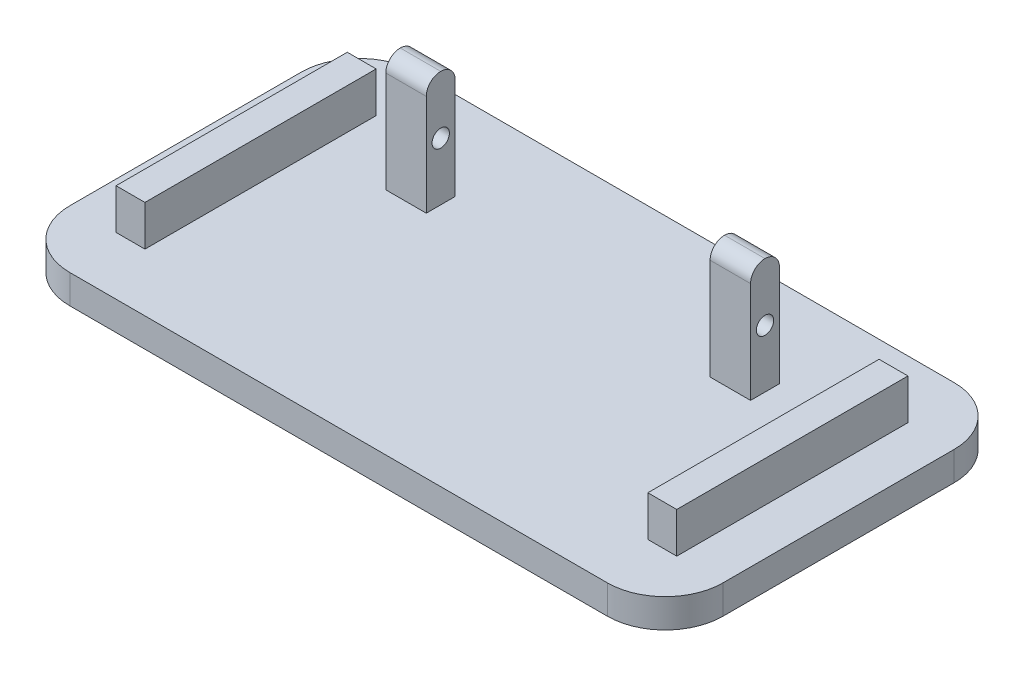
ISO-10303-21;
HEADER;
FILE_DESCRIPTION(('STEP AP214'),'2;1');
FILE_NAME('part.step','',(''),(''),'','','');
FILE_SCHEMA(('AUTOMOTIVE_DESIGN { 1 0 10303 214 1 1 1 1 }'));
ENDSEC;
DATA;
#1=APPLICATION_CONTEXT('core data for automotive mechanical design processes');
#2=APPLICATION_PROTOCOL_DEFINITION('international standard','automotive_design',2000,#1);
#3=PRODUCT_CONTEXT('',#1,'mechanical');
#4=PRODUCT('Part','Part','',(#3));
#5=PRODUCT_RELATED_PRODUCT_CATEGORY('part','',(#4));
#6=PRODUCT_DEFINITION_FORMATION('','',#4);
#7=PRODUCT_DEFINITION_CONTEXT('part definition',#1,'design');
#8=PRODUCT_DEFINITION('design','',#6,#7);
#9=PRODUCT_DEFINITION_SHAPE('','',#8);
#10=(LENGTH_UNIT() NAMED_UNIT(*) SI_UNIT(.MILLI.,.METRE.));
#11=(NAMED_UNIT(*) PLANE_ANGLE_UNIT() SI_UNIT($,.RADIAN.));
#12=(NAMED_UNIT(*) SI_UNIT($,.STERADIAN.) SOLID_ANGLE_UNIT());
#13=UNCERTAINTY_MEASURE_WITH_UNIT(LENGTH_MEASURE(1.E-05),#10,'distance_accuracy_value','');
#14=(GEOMETRIC_REPRESENTATION_CONTEXT(3) GLOBAL_UNCERTAINTY_ASSIGNED_CONTEXT((#13)) GLOBAL_UNIT_ASSIGNED_CONTEXT((#10,
#11,#12)) REPRESENTATION_CONTEXT('',''));
#15=CARTESIAN_POINT('',(0.,0.,0.));
#16=DIRECTION('',(0.,0.,1.));
#17=DIRECTION('',(1.,0.,0.));
#18=AXIS2_PLACEMENT_3D('',#15,#16,#17);
#19=CARTESIAN_POINT('',(79.785498489426,5.,-5.53323262839879));
#20=DIRECTION('',(0.,1.,0.));
#21=DIRECTION('',(0.,0.,1.));
#22=AXIS2_PLACEMENT_3D('',#19,#20,#21);
#23=PLANE('',#22);
#24=CARTESIAN_POINT('',(79.785498489426,5.,-5.53323262839879));
#25=DIRECTION('',(0.,1.,0.));
#26=DIRECTION('',(0.,0.,1.));
#27=AXIS2_PLACEMENT_3D('',#24,#25,#26);
#28=CIRCLE('',#27,10.);
#29=CARTESIAN_POINT('',(89.785498489426,5.,-5.53323262839872));
#30=VERTEX_POINT('',#29);
#31=CARTESIAN_POINT('',(79.7854984894259,5.,-15.5332326283988));
#32=VERTEX_POINT('',#31);
#33=EDGE_CURVE('E313',#30,#32,#28,.T.);
#34=ORIENTED_EDGE('',*,*,#33,.T.);
#35=DIRECTION('',(-1.,0.,0.));
#36=VECTOR('',#35,1.);
#37=CARTESIAN_POINT('',(-13.214501510574,5.,-15.5332326283988));
#38=LINE('',#37,#36);
#39=CARTESIAN_POINT('',(-13.214501510574,5.,-15.5332326283988));
#40=VERTEX_POINT('',#39);
#41=EDGE_CURVE('E316',#32,#40,#38,.T.);
#42=ORIENTED_EDGE('',*,*,#41,.T.);
#43=CARTESIAN_POINT('',(-13.214501510574,5.,-5.5332326283988));
#44=DIRECTION('',(0.,1.,0.));
#45=DIRECTION('',(0.,0.,-1.));
#46=AXIS2_PLACEMENT_3D('',#43,#44,#45);
#47=CIRCLE('',#46,10.);
#48=CARTESIAN_POINT('',(-23.214501510574,5.,-5.53323262839872));
#49=VERTEX_POINT('',#48);
#50=EDGE_CURVE('E319',#40,#49,#47,.T.);
#51=ORIENTED_EDGE('',*,*,#50,.T.);
#52=DIRECTION('',(0.,0.,1.));
#53=VECTOR('',#52,1.);
#54=CARTESIAN_POINT('',(-23.214501510574,5.,-5.53323262839872));
#55=LINE('',#54,#53);
#56=CARTESIAN_POINT('',(-23.214501510574,5.,34.4667673716011));
#57=VERTEX_POINT('',#56);
#58=EDGE_CURVE('E321',#49,#57,#55,.T.);
#59=ORIENTED_EDGE('',*,*,#58,.T.);
#60=CARTESIAN_POINT('',(-13.214501510574,5.,34.4667673716012));
#61=DIRECTION('',(0.,1.,0.));
#62=DIRECTION('',(0.,0.,-1.));
#63=AXIS2_PLACEMENT_3D('',#60,#61,#62);
#64=CIRCLE('',#63,10.);
#65=CARTESIAN_POINT('',(-13.214501510574,5.,44.4667673716012));
#66=VERTEX_POINT('',#65);
#67=EDGE_CURVE('E323',#57,#66,#64,.T.);
#68=ORIENTED_EDGE('',*,*,#67,.T.);
#69=DIRECTION('',(1.,0.,0.));
#70=VECTOR('',#69,1.);
#71=CARTESIAN_POINT('',(-13.214501510574,5.,44.4667673716012));
#72=LINE('',#71,#70);
#73=CARTESIAN_POINT('',(79.7854984894259,5.,44.4667673716012));
#74=VERTEX_POINT('',#73);
#75=EDGE_CURVE('E325',#66,#74,#72,.T.);
#76=ORIENTED_EDGE('',*,*,#75,.T.);
#77=CARTESIAN_POINT('',(79.785498489426,5.,34.4667673716012));
#78=DIRECTION('',(0.,1.,0.));
#79=DIRECTION('',(0.,0.,-1.));
#80=AXIS2_PLACEMENT_3D('',#77,#78,#79);
#81=CIRCLE('',#80,10.);
#82=CARTESIAN_POINT('',(89.785498489426,5.,34.4667673716011));
#83=VERTEX_POINT('',#82);
#84=EDGE_CURVE('E327',#74,#83,#81,.T.);
#85=ORIENTED_EDGE('',*,*,#84,.T.);
#86=DIRECTION('',(0.,0.,-1.));
#87=VECTOR('',#86,1.);
#88=CARTESIAN_POINT('',(89.785498489426,5.,-5.53323262839872));
#89=LINE('',#88,#87);
#90=EDGE_CURVE('E329',#83,#30,#89,.T.);
#91=ORIENTED_EDGE('',*,*,#90,.T.);
#92=EDGE_LOOP('',(#34,#42,#51,#59,#68,#76,#85,#91));
#93=FACE_BOUND('',#92,.T.);
#94=DIRECTION('',(1.,0.,0.));
#95=VECTOR('',#94,1.);
#96=CARTESIAN_POINT('',(1.73549848942599,5.,4.74755716237043));
#97=LINE('',#96,#95);
#98=CARTESIAN_POINT('',(1.73549848942599,5.,4.74755716237043));
#99=VERTEX_POINT('',#98);
#100=CARTESIAN_POINT('',(8.73549848942599,5.,4.74755716237042));
#101=VERTEX_POINT('',#100);
#102=EDGE_CURVE('E295',#99,#101,#97,.T.);
#103=ORIENTED_EDGE('',*,*,#102,.F.);
#104=DIRECTION('',(0.,0.,1.));
#105=VECTOR('',#104,1.);
#106=CARTESIAN_POINT('',(1.73549848942598,5.,-0.252442837629556));
#107=LINE('',#106,#105);
#108=CARTESIAN_POINT('',(1.73549848942598,5.,-0.252442837629556));
#109=VERTEX_POINT('',#108);
#110=EDGE_CURVE('E292',#109,#99,#107,.T.);
#111=ORIENTED_EDGE('',*,*,#110,.F.);
#112=DIRECTION('',(-1.,0.,0.));
#113=VECTOR('',#112,1.);
#114=CARTESIAN_POINT('',(1.73549848942598,5.,-0.252442837629556));
#115=LINE('',#114,#113);
#116=CARTESIAN_POINT('',(8.73549848942598,5.,-0.25244283762956));
#117=VERTEX_POINT('',#116);
#118=EDGE_CURVE('E301',#117,#109,#115,.T.);
#119=ORIENTED_EDGE('',*,*,#118,.F.);
#120=DIRECTION('',(0.,0.,-1.));
#121=VECTOR('',#120,1.);
#122=CARTESIAN_POINT('',(8.73549848942598,5.,-0.25244283762956));
#123=LINE('',#122,#121);
#124=EDGE_CURVE('E298',#101,#117,#123,.T.);
#125=ORIENTED_EDGE('',*,*,#124,.F.);
#126=EDGE_LOOP('',(#103,#111,#119,#125));
#127=FACE_BOUND('',#126,.T.);
#128=DIRECTION('',(0.,0.,1.));
#129=VECTOR('',#128,1.);
#130=CARTESIAN_POINT('',(57.835498489426,5.,-0.252442837629591));
#131=LINE('',#130,#129);
#132=CARTESIAN_POINT('',(57.835498489426,5.,-0.252442837629591));
#133=VERTEX_POINT('',#132);
#134=CARTESIAN_POINT('',(57.835498489426,5.,4.74755716237042));
#135=VERTEX_POINT('',#134);
#136=EDGE_CURVE('E275',#133,#135,#131,.T.);
#137=ORIENTED_EDGE('',*,*,#136,.F.);
#138=DIRECTION('',(-1.,0.,0.));
#139=VECTOR('',#138,1.);
#140=CARTESIAN_POINT('',(57.835498489426,5.,-0.252442837629591));
#141=LINE('',#140,#139);
#142=CARTESIAN_POINT('',(64.835498489426,5.,-0.252442837629594));
#143=VERTEX_POINT('',#142);
#144=EDGE_CURVE('E272',#143,#133,#141,.T.);
#145=ORIENTED_EDGE('',*,*,#144,.F.);
#146=DIRECTION('',(0.,0.,-1.));
#147=VECTOR('',#146,1.);
#148=CARTESIAN_POINT('',(64.835498489426,5.,-0.252442837629594));
#149=LINE('',#148,#147);
#150=CARTESIAN_POINT('',(64.835498489426,5.,4.74755716237042));
#151=VERTEX_POINT('',#150);
#152=EDGE_CURVE('E281',#151,#143,#149,.T.);
#153=ORIENTED_EDGE('',*,*,#152,.F.);
#154=DIRECTION('',(1.,0.,0.));
#155=VECTOR('',#154,1.);
#156=CARTESIAN_POINT('',(57.835498489426,5.,4.74755716237042));
#157=LINE('',#156,#155);
#158=EDGE_CURVE('E278',#135,#151,#157,.T.);
#159=ORIENTED_EDGE('',*,*,#158,.F.);
#160=EDGE_LOOP('',(#137,#145,#153,#159));
#161=FACE_BOUND('',#160,.T.);
#162=DIRECTION('',(1.,0.,0.));
#163=VECTOR('',#162,1.);
#164=CARTESIAN_POINT('',(-15.214501510574,5.,34.4667673716012));
#165=LINE('',#164,#163);
#166=CARTESIAN_POINT('',(-15.214501510574,5.,34.4667673716012));
#167=VERTEX_POINT('',#166);
#168=CARTESIAN_POINT('',(-10.214501510574,5.,34.4667673716012));
#169=VERTEX_POINT('',#168);
#170=EDGE_CURVE('E231',#167,#169,#165,.T.);
#171=ORIENTED_EDGE('',*,*,#170,.F.);
#172=DIRECTION('',(0.,0.,1.));
#173=VECTOR('',#172,1.);
#174=CARTESIAN_POINT('',(-15.214501510574,5.,-5.5332326283988));
#175=LINE('',#174,#173);
#176=CARTESIAN_POINT('',(-15.214501510574,5.,-5.5332326283988));
#177=VERTEX_POINT('',#176);
#178=EDGE_CURVE('E228',#177,#167,#175,.T.);
#179=ORIENTED_EDGE('',*,*,#178,.F.);
#180=DIRECTION('',(-1.,0.,0.));
#181=VECTOR('',#180,1.);
#182=CARTESIAN_POINT('',(-15.214501510574,5.,-5.5332326283988));
#183=LINE('',#182,#181);
#184=CARTESIAN_POINT('',(-10.214501510574,5.,-5.5332326283988));
#185=VERTEX_POINT('',#184);
#186=EDGE_CURVE('E241',#185,#177,#183,.T.);
#187=ORIENTED_EDGE('',*,*,#186,.F.);
#188=DIRECTION('',(0.,0.,-1.));
#189=VECTOR('',#188,1.);
#190=CARTESIAN_POINT('',(-10.214501510574,5.,-5.5332326283988));
#191=LINE('',#190,#189);
#192=EDGE_CURVE('E249',#169,#185,#191,.T.);
#193=ORIENTED_EDGE('',*,*,#192,.F.);
#194=EDGE_LOOP('',(#171,#179,#187,#193));
#195=FACE_BOUND('',#194,.T.);
#196=DIRECTION('',(1.,0.,0.));
#197=VECTOR('',#196,1.);
#198=CARTESIAN_POINT('',(76.785498489426,5.,34.4667673716012));
#199=LINE('',#198,#197);
#200=CARTESIAN_POINT('',(76.785498489426,5.,34.4667673716012));
#201=VERTEX_POINT('',#200);
#202=CARTESIAN_POINT('',(81.785498489426,5.,34.4667673716012));
#203=VERTEX_POINT('',#202);
#204=EDGE_CURVE('E417',#201,#203,#199,.T.);
#205=ORIENTED_EDGE('',*,*,#204,.F.);
#206=DIRECTION('',(0.,0.,1.));
#207=VECTOR('',#206,1.);
#208=CARTESIAN_POINT('',(76.7854984894259,5.,-5.5332326283988));
#209=LINE('',#208,#207);
#210=CARTESIAN_POINT('',(76.7854984894259,5.,-5.5332326283988));
#211=VERTEX_POINT('',#210);
#212=EDGE_CURVE('E226',#211,#201,#209,.T.);
#213=ORIENTED_EDGE('',*,*,#212,.F.);
#214=DIRECTION('',(-1.,0.,0.));
#215=VECTOR('',#214,1.);
#216=CARTESIAN_POINT('',(76.7854984894259,5.,-5.5332326283988));
#217=LINE('',#216,#215);
#218=CARTESIAN_POINT('',(81.785498489426,5.,-5.5332326283988));
#219=VERTEX_POINT('',#218);
#220=EDGE_CURVE('E222',#219,#211,#217,.T.);
#221=ORIENTED_EDGE('',*,*,#220,.F.);
#222=DIRECTION('',(0.,0.,-1.));
#223=VECTOR('',#222,1.);
#224=CARTESIAN_POINT('',(81.785498489426,5.,-5.5332326283988));
#225=LINE('',#224,#223);
#226=EDGE_CURVE('E419',#203,#219,#225,.T.);
#227=ORIENTED_EDGE('',*,*,#226,.F.);
#228=EDGE_LOOP('',(#205,#213,#221,#227));
#229=FACE_BOUND('',#228,.T.);
#230=ADVANCED_FACE('F33',(#93,#127,#161,#195,#229),#23,.T.);
#231=CARTESIAN_POINT('',(79.785498489426,5.,-5.53323262839879));
#232=DIRECTION('',(0.,-1.,0.));
#233=DIRECTION('',(0.,0.,-1.));
#234=AXIS2_PLACEMENT_3D('',#231,#232,#233);
#235=CYLINDRICAL_SURFACE('',#234,10.);
#236=CARTESIAN_POINT('',(79.785498489426,0.,-5.53323262839879));
#237=DIRECTION('',(0.,1.,0.));
#238=DIRECTION('',(0.,0.,1.));
#239=AXIS2_PLACEMENT_3D('',#236,#237,#238);
#240=CIRCLE('',#239,10.);
#241=CARTESIAN_POINT('',(89.785498489426,0.,-5.53323262839872));
#242=VERTEX_POINT('',#241);
#243=CARTESIAN_POINT('',(79.7854984894259,0.,-15.5332326283988));
#244=VERTEX_POINT('',#243);
#245=EDGE_CURVE('E312',#242,#244,#240,.T.);
#246=ORIENTED_EDGE('',*,*,#245,.T.);
#247=DIRECTION('',(0.,-1.,0.));
#248=VECTOR('',#247,1.);
#249=CARTESIAN_POINT('',(79.7854984894259,5.,-15.5332326283988));
#250=LINE('',#249,#248);
#251=EDGE_CURVE('E367',#32,#244,#250,.T.);
#252=ORIENTED_EDGE('',*,*,#251,.F.);
#253=ORIENTED_EDGE('',*,*,#33,.F.);
#254=DIRECTION('',(0.,-1.,0.));
#255=VECTOR('',#254,1.);
#256=CARTESIAN_POINT('',(89.785498489426,5.,-5.53323262839872));
#257=LINE('',#256,#255);
#258=EDGE_CURVE('E331',#30,#242,#257,.T.);
#259=ORIENTED_EDGE('',*,*,#258,.T.);
#260=EDGE_LOOP('',(#246,#252,#253,#259));
#261=FACE_BOUND('',#260,.T.);
#262=ADVANCED_FACE('F437',(#261),#235,.T.);
#263=CARTESIAN_POINT('',(-13.214501510574,5.,-15.5332326283988));
#264=DIRECTION('',(0.,0.,1.));
#265=DIRECTION('',(1.,0.,0.));
#266=AXIS2_PLACEMENT_3D('',#263,#264,#265);
#267=PLANE('',#266);
#268=DIRECTION('',(-1.,0.,0.));
#269=VECTOR('',#268,1.);
#270=CARTESIAN_POINT('',(-13.214501510574,0.,-15.5332326283988));
#271=LINE('',#270,#269);
#272=CARTESIAN_POINT('',(-13.214501510574,0.,-15.5332326283988));
#273=VERTEX_POINT('',#272);
#274=EDGE_CURVE('E334',#244,#273,#271,.T.);
#275=ORIENTED_EDGE('',*,*,#274,.T.);
#276=DIRECTION('',(0.,-1.,0.));
#277=VECTOR('',#276,1.);
#278=CARTESIAN_POINT('',(-13.214501510574,5.,-15.5332326283988));
#279=LINE('',#278,#277);
#280=EDGE_CURVE('E364',#40,#273,#279,.T.);
#281=ORIENTED_EDGE('',*,*,#280,.F.);
#282=ORIENTED_EDGE('',*,*,#41,.F.);
#283=ORIENTED_EDGE('',*,*,#251,.T.);
#284=EDGE_LOOP('',(#275,#281,#282,#283));
#285=FACE_BOUND('',#284,.T.);
#286=ADVANCED_FACE('F443',(#285),#267,.F.);
#287=CARTESIAN_POINT('',(-13.214501510574,5.,-5.5332326283988));
#288=DIRECTION('',(0.,-1.,0.));
#289=DIRECTION('',(0.,0.,-1.));
#290=AXIS2_PLACEMENT_3D('',#287,#288,#289);
#291=CYLINDRICAL_SURFACE('',#290,10.);
#292=CARTESIAN_POINT('',(-13.214501510574,0.,-5.5332326283988));
#293=DIRECTION('',(0.,1.,0.));
#294=DIRECTION('',(0.,0.,-1.));
#295=AXIS2_PLACEMENT_3D('',#292,#293,#294);
#296=CIRCLE('',#295,10.);
#297=CARTESIAN_POINT('',(-23.214501510574,0.,-5.53323262839872));
#298=VERTEX_POINT('',#297);
#299=EDGE_CURVE('E336',#273,#298,#296,.T.);
#300=ORIENTED_EDGE('',*,*,#299,.T.);
#301=DIRECTION('',(0.,-1.,0.));
#302=VECTOR('',#301,1.);
#303=CARTESIAN_POINT('',(-23.214501510574,5.,-5.53323262839872));
#304=LINE('',#303,#302);
#305=EDGE_CURVE('E361',#49,#298,#304,.T.);
#306=ORIENTED_EDGE('',*,*,#305,.F.);
#307=ORIENTED_EDGE('',*,*,#50,.F.);
#308=ORIENTED_EDGE('',*,*,#280,.T.);
#309=EDGE_LOOP('',(#300,#306,#307,#308));
#310=FACE_BOUND('',#309,.T.);
#311=ADVANCED_FACE('F474',(#310),#291,.T.);
#312=CARTESIAN_POINT('',(-23.214501510574,5.,-5.53323262839872));
#313=DIRECTION('',(1.,0.,0.));
#314=DIRECTION('',(0.,0.,-1.));
#315=AXIS2_PLACEMENT_3D('',#312,#313,#314);
#316=PLANE('',#315);
#317=DIRECTION('',(0.,0.,1.));
#318=VECTOR('',#317,1.);
#319=CARTESIAN_POINT('',(-23.214501510574,0.,-5.53323262839872));
#320=LINE('',#319,#318);
#321=CARTESIAN_POINT('',(-23.214501510574,0.,34.4667673716011));
#322=VERTEX_POINT('',#321);
#323=EDGE_CURVE('E338',#298,#322,#320,.T.);
#324=ORIENTED_EDGE('',*,*,#323,.T.);
#325=DIRECTION('',(0.,-1.,0.));
#326=VECTOR('',#325,1.);
#327=CARTESIAN_POINT('',(-23.214501510574,5.,34.4667673716011));
#328=LINE('',#327,#326);
#329=EDGE_CURVE('E358',#57,#322,#328,.T.);
#330=ORIENTED_EDGE('',*,*,#329,.F.);
#331=ORIENTED_EDGE('',*,*,#58,.F.);
#332=ORIENTED_EDGE('',*,*,#305,.T.);
#333=EDGE_LOOP('',(#324,#330,#331,#332));
#334=FACE_BOUND('',#333,.T.);
#335=ADVANCED_FACE('F470',(#334),#316,.F.);
#336=CARTESIAN_POINT('',(-13.214501510574,5.,34.4667673716012));
#337=DIRECTION('',(0.,-1.,0.));
#338=DIRECTION('',(0.,0.,-1.));
#339=AXIS2_PLACEMENT_3D('',#336,#337,#338);
#340=CYLINDRICAL_SURFACE('',#339,10.);
#341=CARTESIAN_POINT('',(-13.214501510574,0.,34.4667673716012));
#342=DIRECTION('',(0.,1.,0.));
#343=DIRECTION('',(0.,0.,-1.));
#344=AXIS2_PLACEMENT_3D('',#341,#342,#343);
#345=CIRCLE('',#344,10.);
#346=CARTESIAN_POINT('',(-13.214501510574,0.,44.4667673716012));
#347=VERTEX_POINT('',#346);
#348=EDGE_CURVE('E340',#322,#347,#345,.T.);
#349=ORIENTED_EDGE('',*,*,#348,.T.);
#350=DIRECTION('',(0.,-1.,0.));
#351=VECTOR('',#350,1.);
#352=CARTESIAN_POINT('',(-13.214501510574,5.,44.4667673716012));
#353=LINE('',#352,#351);
#354=EDGE_CURVE('E355',#66,#347,#353,.T.);
#355=ORIENTED_EDGE('',*,*,#354,.F.);
#356=ORIENTED_EDGE('',*,*,#67,.F.);
#357=ORIENTED_EDGE('',*,*,#329,.T.);
#358=EDGE_LOOP('',(#349,#355,#356,#357));
#359=FACE_BOUND('',#358,.T.);
#360=ADVANCED_FACE('F466',(#359),#340,.T.);
#361=CARTESIAN_POINT('',(-13.214501510574,5.,44.4667673716012));
#362=DIRECTION('',(0.,0.,-1.));
#363=DIRECTION('',(-1.,0.,0.));
#364=AXIS2_PLACEMENT_3D('',#361,#362,#363);
#365=PLANE('',#364);
#366=DIRECTION('',(1.,0.,0.));
#367=VECTOR('',#366,1.);
#368=CARTESIAN_POINT('',(-13.214501510574,0.,44.4667673716012));
#369=LINE('',#368,#367);
#370=CARTESIAN_POINT('',(79.7854984894259,0.,44.4667673716012));
#371=VERTEX_POINT('',#370);
#372=EDGE_CURVE('E342',#347,#371,#369,.T.);
#373=ORIENTED_EDGE('',*,*,#372,.T.);
#374=DIRECTION('',(0.,-1.,0.));
#375=VECTOR('',#374,1.);
#376=CARTESIAN_POINT('',(79.7854984894259,5.,44.4667673716012));
#377=LINE('',#376,#375);
#378=EDGE_CURVE('E352',#74,#371,#377,.T.);
#379=ORIENTED_EDGE('',*,*,#378,.F.);
#380=ORIENTED_EDGE('',*,*,#75,.F.);
#381=ORIENTED_EDGE('',*,*,#354,.T.);
#382=EDGE_LOOP('',(#373,#379,#380,#381));
#383=FACE_BOUND('',#382,.T.);
#384=ADVANCED_FACE('F462',(#383),#365,.F.);
#385=CARTESIAN_POINT('',(79.785498489426,5.,34.4667673716012));
#386=DIRECTION('',(0.,-1.,0.));
#387=DIRECTION('',(0.,0.,-1.));
#388=AXIS2_PLACEMENT_3D('',#385,#386,#387);
#389=CYLINDRICAL_SURFACE('',#388,10.);
#390=CARTESIAN_POINT('',(79.785498489426,0.,34.4667673716012));
#391=DIRECTION('',(0.,1.,0.));
#392=DIRECTION('',(0.,0.,-1.));
#393=AXIS2_PLACEMENT_3D('',#390,#391,#392);
#394=CIRCLE('',#393,10.);
#395=CARTESIAN_POINT('',(89.785498489426,0.,34.4667673716011));
#396=VERTEX_POINT('',#395);
#397=EDGE_CURVE('E344',#371,#396,#394,.T.);
#398=ORIENTED_EDGE('',*,*,#397,.T.);
#399=DIRECTION('',(0.,-1.,0.));
#400=VECTOR('',#399,1.);
#401=CARTESIAN_POINT('',(89.785498489426,5.,34.4667673716011));
#402=LINE('',#401,#400);
#403=EDGE_CURVE('E349',#83,#396,#402,.T.);
#404=ORIENTED_EDGE('',*,*,#403,.F.);
#405=ORIENTED_EDGE('',*,*,#84,.F.);
#406=ORIENTED_EDGE('',*,*,#378,.T.);
#407=EDGE_LOOP('',(#398,#404,#405,#406));
#408=FACE_BOUND('',#407,.T.);
#409=ADVANCED_FACE('F458',(#408),#389,.T.);
#410=CARTESIAN_POINT('',(89.785498489426,5.,-5.53323262839872));
#411=DIRECTION('',(-1.,0.,0.));
#412=DIRECTION('',(0.,0.,1.));
#413=AXIS2_PLACEMENT_3D('',#410,#411,#412);
#414=PLANE('',#413);
#415=DIRECTION('',(0.,0.,-1.));
#416=VECTOR('',#415,1.);
#417=CARTESIAN_POINT('',(89.785498489426,0.,-5.53323262839872));
#418=LINE('',#417,#416);
#419=EDGE_CURVE('E317',#396,#242,#418,.T.);
#420=ORIENTED_EDGE('',*,*,#419,.T.);
#421=ORIENTED_EDGE('',*,*,#258,.F.);
#422=ORIENTED_EDGE('',*,*,#90,.F.);
#423=ORIENTED_EDGE('',*,*,#403,.T.);
#424=EDGE_LOOP('',(#420,#421,#422,#423));
#425=FACE_BOUND('',#424,.T.);
#426=ADVANCED_FACE('F454',(#425),#414,.F.);
#427=CARTESIAN_POINT('',(79.785498489426,0.,-5.53323262839879));
#428=DIRECTION('',(0.,1.,0.));
#429=DIRECTION('',(0.,0.,1.));
#430=AXIS2_PLACEMENT_3D('',#427,#428,#429);
#431=PLANE('',#430);
#432=ORIENTED_EDGE('',*,*,#245,.F.);
#433=ORIENTED_EDGE('',*,*,#419,.F.);
#434=ORIENTED_EDGE('',*,*,#397,.F.);
#435=ORIENTED_EDGE('',*,*,#372,.F.);
#436=ORIENTED_EDGE('',*,*,#348,.F.);
#437=ORIENTED_EDGE('',*,*,#323,.F.);
#438=ORIENTED_EDGE('',*,*,#299,.F.);
#439=ORIENTED_EDGE('',*,*,#274,.F.);
#440=EDGE_LOOP('',(#432,#433,#434,#435,#436,#437,#438,#439));
#441=FACE_BOUND('',#440,.T.);
#442=ADVANCED_FACE('F451',(#441),#431,.F.);
#443=CARTESIAN_POINT('',(1.73549848942598,25.,-0.252442837629556));
#444=DIRECTION('',(1.,0.,0.));
#445=DIRECTION('',(0.,0.,-1.));
#446=AXIS2_PLACEMENT_3D('',#443,#444,#445);
#447=PLANE('',#446);
#448=CARTESIAN_POINT('',(1.73549848942599,15.,2.24755716237043));
#449=DIRECTION('',(-1.,0.,0.));
#450=DIRECTION('',(0.,0.,1.));
#451=AXIS2_PLACEMENT_3D('',#448,#449,#450);
#452=CIRCLE('',#451,1.5);
#453=CARTESIAN_POINT('',(1.73549848942599,15.,3.74755716237043));
#454=VERTEX_POINT('',#453);
#455=EDGE_CURVE('E262',#454,#454,#452,.T.);
#456=ORIENTED_EDGE('',*,*,#455,.F.);
#457=EDGE_LOOP('',(#456));
#458=FACE_BOUND('',#457,.T.);
#459=DIRECTION('',(0.,-1.,0.));
#460=VECTOR('',#459,1.);
#461=CARTESIAN_POINT('',(1.73549848942599,25.,4.74755716237043));
#462=LINE('',#461,#460);
#463=CARTESIAN_POINT('',(1.73549848942599,22.5,4.74755716237043));
#464=VERTEX_POINT('',#463);
#465=EDGE_CURVE('E310',#464,#99,#462,.T.);
#466=ORIENTED_EDGE('',*,*,#465,.F.);
#467=CARTESIAN_POINT('',(1.73549848942599,22.5,2.24755716237043));
#468=DIRECTION('',(1.,0.,0.));
#469=DIRECTION('',(0.,0.,-1.));
#470=AXIS2_PLACEMENT_3D('',#467,#468,#469);
#471=CIRCLE('',#470,2.5);
#472=CARTESIAN_POINT('',(1.73549848942599,25.,2.24755716237044));
#473=VERTEX_POINT('',#472);
#474=EDGE_CURVE('E386',#464,#473,#471,.F.);
#475=ORIENTED_EDGE('',*,*,#474,.T.);
#476=CARTESIAN_POINT('',(1.73549848942599,22.5,2.24755716237044));
#477=DIRECTION('',(1.,0.,0.));
#478=DIRECTION('',(0.,0.,-1.));
#479=AXIS2_PLACEMENT_3D('',#476,#477,#478);
#480=CIRCLE('',#479,2.5);
#481=CARTESIAN_POINT('',(1.73549848942598,22.5,-0.252442837629556));
#482=VERTEX_POINT('',#481);
#483=EDGE_CURVE('E375',#473,#482,#480,.F.);
#484=ORIENTED_EDGE('',*,*,#483,.T.);
#485=DIRECTION('',(0.,-1.,0.));
#486=VECTOR('',#485,1.);
#487=CARTESIAN_POINT('',(1.73549848942598,25.,-0.252442837629556));
#488=LINE('',#487,#486);
#489=EDGE_CURVE('E304',#482,#109,#488,.T.);
#490=ORIENTED_EDGE('',*,*,#489,.T.);
#491=ORIENTED_EDGE('',*,*,#110,.T.);
#492=EDGE_LOOP('',(#466,#475,#484,#490,#491));
#493=FACE_BOUND('',#492,.T.);
#494=ADVANCED_FACE('F449',(#458,#493),#447,.F.);
#495=CARTESIAN_POINT('',(1.73549848942599,25.,4.74755716237043));
#496=DIRECTION('',(0.,0.,-1.));
#497=DIRECTION('',(-1.,0.,0.));
#498=AXIS2_PLACEMENT_3D('',#495,#496,#497);
#499=PLANE('',#498);
#500=DIRECTION('',(0.,-1.,0.));
#501=VECTOR('',#500,1.);
#502=CARTESIAN_POINT('',(8.73549848942599,25.,4.74755716237042));
#503=LINE('',#502,#501);
#504=CARTESIAN_POINT('',(8.73549848942599,22.5,4.74755716237042));
#505=VERTEX_POINT('',#504);
#506=EDGE_CURVE('E308',#505,#101,#503,.T.);
#507=ORIENTED_EDGE('',*,*,#506,.F.);
#508=DIRECTION('',(1.,0.,0.));
#509=VECTOR('',#508,1.);
#510=CARTESIAN_POINT('',(1.73549848942599,22.5,4.74755716237043));
#511=LINE('',#510,#509);
#512=EDGE_CURVE('E384',#505,#464,#511,.F.);
#513=ORIENTED_EDGE('',*,*,#512,.T.);
#514=ORIENTED_EDGE('',*,*,#465,.T.);
#515=ORIENTED_EDGE('',*,*,#102,.T.);
#516=EDGE_LOOP('',(#507,#513,#514,#515));
#517=FACE_BOUND('',#516,.T.);
#518=ADVANCED_FACE('F513',(#517),#499,.F.);
#519=CARTESIAN_POINT('',(8.73549848942598,25.,-0.25244283762956));
#520=DIRECTION('',(-1.,0.,0.));
#521=DIRECTION('',(0.,0.,1.));
#522=AXIS2_PLACEMENT_3D('',#519,#520,#521);
#523=PLANE('',#522);
#524=CARTESIAN_POINT('',(8.73549848942598,15.,2.24755716237042));
#525=DIRECTION('',(-1.,0.,0.));
#526=DIRECTION('',(0.,0.,1.));
#527=AXIS2_PLACEMENT_3D('',#524,#525,#526);
#528=CIRCLE('',#527,1.5);
#529=CARTESIAN_POINT('',(8.73549848942598,15.,3.74755716237042));
#530=VERTEX_POINT('',#529);
#531=EDGE_CURVE('E269',#530,#530,#528,.T.);
#532=ORIENTED_EDGE('',*,*,#531,.T.);
#533=EDGE_LOOP('',(#532));
#534=FACE_BOUND('',#533,.T.);
#535=CARTESIAN_POINT('',(8.73549848942599,22.5,2.24755716237044));
#536=DIRECTION('',(-1.,0.,0.));
#537=DIRECTION('',(0.,0.,1.));
#538=AXIS2_PLACEMENT_3D('',#535,#536,#537);
#539=CIRCLE('',#538,2.5);
#540=CARTESIAN_POINT('',(8.73549848942598,22.5,-0.25244283762956));
#541=VERTEX_POINT('',#540);
#542=CARTESIAN_POINT('',(8.73549848942599,25.,2.24755716237044));
#543=VERTEX_POINT('',#542);
#544=EDGE_CURVE('E379',#541,#543,#539,.F.);
#545=ORIENTED_EDGE('',*,*,#544,.T.);
#546=CARTESIAN_POINT('',(8.73549848942599,22.5,2.24755716237042));
#547=DIRECTION('',(-1.,0.,0.));
#548=DIRECTION('',(0.,0.,1.));
#549=AXIS2_PLACEMENT_3D('',#546,#547,#548);
#550=CIRCLE('',#549,2.5);
#551=EDGE_CURVE('E382',#543,#505,#550,.F.);
#552=ORIENTED_EDGE('',*,*,#551,.T.);
#553=ORIENTED_EDGE('',*,*,#506,.T.);
#554=ORIENTED_EDGE('',*,*,#124,.T.);
#555=DIRECTION('',(0.,-1.,0.));
#556=VECTOR('',#555,1.);
#557=CARTESIAN_POINT('',(8.73549848942598,25.,-0.25244283762956));
#558=LINE('',#557,#556);
#559=EDGE_CURVE('E306',#541,#117,#558,.T.);
#560=ORIENTED_EDGE('',*,*,#559,.F.);
#561=EDGE_LOOP('',(#545,#552,#553,#554,#560));
#562=FACE_BOUND('',#561,.T.);
#563=ADVANCED_FACE('F507',(#534,#562),#523,.F.);
#564=CARTESIAN_POINT('',(1.73549848942598,25.,-0.252442837629556));
#565=DIRECTION('',(0.,0.,1.));
#566=DIRECTION('',(1.,0.,0.));
#567=AXIS2_PLACEMENT_3D('',#564,#565,#566);
#568=PLANE('',#567);
#569=ORIENTED_EDGE('',*,*,#489,.F.);
#570=DIRECTION('',(-1.,0.,0.));
#571=VECTOR('',#570,1.);
#572=CARTESIAN_POINT('',(8.73549848942598,22.5,-0.25244283762956));
#573=LINE('',#572,#571);
#574=EDGE_CURVE('E377',#482,#541,#573,.F.);
#575=ORIENTED_EDGE('',*,*,#574,.T.);
#576=ORIENTED_EDGE('',*,*,#559,.T.);
#577=ORIENTED_EDGE('',*,*,#118,.T.);
#578=EDGE_LOOP('',(#569,#575,#576,#577));
#579=FACE_BOUND('',#578,.T.);
#580=ADVANCED_FACE('F499',(#579),#568,.F.);
#581=CARTESIAN_POINT('',(57.835498489426,25.,-0.252442837629591));
#582=DIRECTION('',(0.,0.,1.));
#583=DIRECTION('',(1.,0.,0.));
#584=AXIS2_PLACEMENT_3D('',#581,#582,#583);
#585=PLANE('',#584);
#586=DIRECTION('',(0.,-1.,0.));
#587=VECTOR('',#586,1.);
#588=CARTESIAN_POINT('',(57.835498489426,25.,-0.252442837629591));
#589=LINE('',#588,#587);
#590=CARTESIAN_POINT('',(57.835498489426,22.5,-0.252442837629591));
#591=VERTEX_POINT('',#590);
#592=EDGE_CURVE('E290',#591,#133,#589,.T.);
#593=ORIENTED_EDGE('',*,*,#592,.F.);
#594=DIRECTION('',(-1.,0.,0.));
#595=VECTOR('',#594,1.);
#596=CARTESIAN_POINT('',(57.835498489426,22.5,-0.252442837629591));
#597=LINE('',#596,#595);
#598=CARTESIAN_POINT('',(64.835498489426,22.5,-0.252442837629594));
#599=VERTEX_POINT('',#598);
#600=EDGE_CURVE('E11',#591,#599,#597,.F.);
#601=ORIENTED_EDGE('',*,*,#600,.T.);
#602=DIRECTION('',(0.,-1.,0.));
#603=VECTOR('',#602,1.);
#604=CARTESIAN_POINT('',(64.835498489426,25.,-0.252442837629594));
#605=LINE('',#604,#603);
#606=EDGE_CURVE('E284',#599,#143,#605,.T.);
#607=ORIENTED_EDGE('',*,*,#606,.T.);
#608=ORIENTED_EDGE('',*,*,#144,.T.);
#609=EDGE_LOOP('',(#593,#601,#607,#608));
#610=FACE_BOUND('',#609,.T.);
#611=ADVANCED_FACE('F497',(#610),#585,.F.);
#612=CARTESIAN_POINT('',(57.835498489426,25.,-0.252442837629591));
#613=DIRECTION('',(1.,0.,0.));
#614=DIRECTION('',(0.,0.,-1.));
#615=AXIS2_PLACEMENT_3D('',#612,#613,#614);
#616=PLANE('',#615);
#617=CARTESIAN_POINT('',(57.835498489426,15.,2.24755716237042));
#618=DIRECTION('',(1.,0.,0.));
#619=DIRECTION('',(0.,0.,-1.));
#620=AXIS2_PLACEMENT_3D('',#617,#618,#619);
#621=CIRCLE('',#620,1.5);
#622=CARTESIAN_POINT('',(57.835498489426,15.,0.747557162370421));
#623=VERTEX_POINT('',#622);
#624=EDGE_CURVE('E266',#623,#623,#621,.T.);
#625=ORIENTED_EDGE('',*,*,#624,.T.);
#626=EDGE_LOOP('',(#625));
#627=FACE_BOUND('',#626,.T.);
#628=DIRECTION('',(0.,-1.,0.));
#629=VECTOR('',#628,1.);
#630=CARTESIAN_POINT('',(57.835498489426,25.,4.74755716237042));
#631=LINE('',#630,#629);
#632=CARTESIAN_POINT('',(57.835498489426,22.5,4.74755716237042));
#633=VERTEX_POINT('',#632);
#634=EDGE_CURVE('E288',#633,#135,#631,.T.);
#635=ORIENTED_EDGE('',*,*,#634,.F.);
#636=CARTESIAN_POINT('',(57.835498489426,22.5,2.24755716237042));
#637=DIRECTION('',(1.,0.,0.));
#638=DIRECTION('',(0.,0.,-1.));
#639=AXIS2_PLACEMENT_3D('',#636,#637,#638);
#640=CIRCLE('',#639,2.5);
#641=CARTESIAN_POINT('',(57.835498489426,25.,2.24755716237041));
#642=VERTEX_POINT('',#641);
#643=EDGE_CURVE('E42',#633,#642,#640,.F.);
#644=ORIENTED_EDGE('',*,*,#643,.T.);
#645=CARTESIAN_POINT('',(57.835498489426,22.5,2.24755716237041));
#646=DIRECTION('',(1.,0.,0.));
#647=DIRECTION('',(0.,0.,-1.));
#648=AXIS2_PLACEMENT_3D('',#645,#646,#647);
#649=CIRCLE('',#648,2.5);
#650=EDGE_CURVE('E49',#642,#591,#649,.F.);
#651=ORIENTED_EDGE('',*,*,#650,.T.);
#652=ORIENTED_EDGE('',*,*,#592,.T.);
#653=ORIENTED_EDGE('',*,*,#136,.T.);
#654=EDGE_LOOP('',(#635,#644,#651,#652,#653));
#655=FACE_BOUND('',#654,.T.);
#656=ADVANCED_FACE('F402',(#627,#655),#616,.F.);
#657=CARTESIAN_POINT('',(57.835498489426,25.,4.74755716237042));
#658=DIRECTION('',(0.,0.,-1.));
#659=DIRECTION('',(-1.,0.,0.));
#660=AXIS2_PLACEMENT_3D('',#657,#658,#659);
#661=PLANE('',#660);
#662=DIRECTION('',(0.,-1.,0.));
#663=VECTOR('',#662,1.);
#664=CARTESIAN_POINT('',(64.835498489426,25.,4.74755716237042));
#665=LINE('',#664,#663);
#666=CARTESIAN_POINT('',(64.835498489426,22.5,4.74755716237042));
#667=VERTEX_POINT('',#666);
#668=EDGE_CURVE('E286',#667,#151,#665,.T.);
#669=ORIENTED_EDGE('',*,*,#668,.F.);
#670=DIRECTION('',(1.,0.,0.));
#671=VECTOR('',#670,1.);
#672=CARTESIAN_POINT('',(57.835498489426,22.5,4.74755716237042));
#673=LINE('',#672,#671);
#674=EDGE_CURVE('E392',#667,#633,#673,.F.);
#675=ORIENTED_EDGE('',*,*,#674,.T.);
#676=ORIENTED_EDGE('',*,*,#634,.T.);
#677=ORIENTED_EDGE('',*,*,#158,.T.);
#678=EDGE_LOOP('',(#669,#675,#676,#677));
#679=FACE_BOUND('',#678,.T.);
#680=ADVANCED_FACE('F399',(#679),#661,.F.);
#681=CARTESIAN_POINT('',(64.835498489426,25.,-0.252442837629594));
#682=DIRECTION('',(-1.,0.,0.));
#683=DIRECTION('',(0.,0.,1.));
#684=AXIS2_PLACEMENT_3D('',#681,#682,#683);
#685=PLANE('',#684);
#686=CARTESIAN_POINT('',(64.835498489426,15.,2.24755716237042));
#687=DIRECTION('',(-1.,0.,0.));
#688=DIRECTION('',(0.,0.,1.));
#689=AXIS2_PLACEMENT_3D('',#686,#687,#688);
#690=CIRCLE('',#689,1.5);
#691=CARTESIAN_POINT('',(64.835498489426,15.,3.74755716237042));
#692=VERTEX_POINT('',#691);
#693=EDGE_CURVE('E265',#692,#692,#690,.T.);
#694=ORIENTED_EDGE('',*,*,#693,.T.);
#695=EDGE_LOOP('',(#694));
#696=FACE_BOUND('',#695,.T.);
#697=CARTESIAN_POINT('',(64.835498489426,22.5,2.24755716237041));
#698=DIRECTION('',(-1.,0.,0.));
#699=DIRECTION('',(0.,0.,1.));
#700=AXIS2_PLACEMENT_3D('',#697,#698,#699);
#701=CIRCLE('',#700,2.5);
#702=CARTESIAN_POINT('',(64.835498489426,25.,2.24755716237041));
#703=VERTEX_POINT('',#702);
#704=EDGE_CURVE('E388',#599,#703,#701,.F.);
#705=ORIENTED_EDGE('',*,*,#704,.T.);
#706=CARTESIAN_POINT('',(64.835498489426,22.5,2.24755716237042));
#707=DIRECTION('',(-1.,0.,0.));
#708=DIRECTION('',(0.,0.,1.));
#709=AXIS2_PLACEMENT_3D('',#706,#707,#708);
#710=CIRCLE('',#709,2.5);
#711=EDGE_CURVE('E390',#703,#667,#710,.F.);
#712=ORIENTED_EDGE('',*,*,#711,.T.);
#713=ORIENTED_EDGE('',*,*,#668,.T.);
#714=ORIENTED_EDGE('',*,*,#152,.T.);
#715=ORIENTED_EDGE('',*,*,#606,.F.);
#716=EDGE_LOOP('',(#705,#712,#713,#714,#715));
#717=FACE_BOUND('',#716,.T.);
#718=ADVANCED_FACE('F411',(#696,#717),#685,.F.);
#719=CARTESIAN_POINT('',(89.785498489426,15.,2.24755716237042));
#720=DIRECTION('',(-1.,0.,0.));
#721=DIRECTION('',(0.,0.,1.));
#722=AXIS2_PLACEMENT_3D('',#719,#720,#721);
#723=CYLINDRICAL_SURFACE('',#722,1.5);
#724=ORIENTED_EDGE('',*,*,#693,.F.);
#725=EDGE_LOOP('',(#724));
#726=FACE_BOUND('',#725,.T.);
#727=ORIENTED_EDGE('',*,*,#624,.F.);
#728=EDGE_LOOP('',(#727));
#729=FACE_BOUND('',#728,.T.);
#730=ADVANCED_FACE('F545',(#726,#729),#723,.F.);
#731=ORIENTED_EDGE('',*,*,#455,.T.);
#732=EDGE_LOOP('',(#731));
#733=FACE_BOUND('',#732,.T.);
#734=ORIENTED_EDGE('',*,*,#531,.F.);
#735=EDGE_LOOP('',(#734));
#736=FACE_BOUND('',#735,.T.);
#737=ADVANCED_FACE('F541',(#733,#736),#723,.F.);
#738=CARTESIAN_POINT('',(-15.214501510574,12.,-5.5332326283988));
#739=DIRECTION('',(1.,0.,0.));
#740=DIRECTION('',(0.,0.,-1.));
#741=AXIS2_PLACEMENT_3D('',#738,#739,#740);
#742=PLANE('',#741);
#743=ORIENTED_EDGE('',*,*,#178,.T.);
#744=DIRECTION('',(0.,-1.,0.));
#745=VECTOR('',#744,1.);
#746=CARTESIAN_POINT('',(-15.214501510574,12.,34.4667673716012));
#747=LINE('',#746,#745);
#748=CARTESIAN_POINT('',(-15.214501510574,12.,34.4667673716012));
#749=VERTEX_POINT('',#748);
#750=EDGE_CURVE('E260',#749,#167,#747,.T.);
#751=ORIENTED_EDGE('',*,*,#750,.F.);
#752=DIRECTION('',(0.,0.,1.));
#753=VECTOR('',#752,1.);
#754=CARTESIAN_POINT('',(-15.214501510574,12.,-5.5332326283988));
#755=LINE('',#754,#753);
#756=CARTESIAN_POINT('',(-15.214501510574,12.,-5.5332326283988));
#757=VERTEX_POINT('',#756);
#758=EDGE_CURVE('E237',#757,#749,#755,.T.);
#759=ORIENTED_EDGE('',*,*,#758,.F.);
#760=DIRECTION('',(0.,-1.,0.));
#761=VECTOR('',#760,1.);
#762=CARTESIAN_POINT('',(-15.214501510574,12.,-5.5332326283988));
#763=LINE('',#762,#761);
#764=EDGE_CURVE('E246',#757,#177,#763,.T.);
#765=ORIENTED_EDGE('',*,*,#764,.T.);
#766=EDGE_LOOP('',(#743,#751,#759,#765));
#767=FACE_BOUND('',#766,.T.);
#768=ADVANCED_FACE('F544',(#767),#742,.F.);
#769=CARTESIAN_POINT('',(-15.214501510574,12.,34.4667673716012));
#770=DIRECTION('',(0.,0.,-1.));
#771=DIRECTION('',(-1.,0.,0.));
#772=AXIS2_PLACEMENT_3D('',#769,#770,#771);
#773=PLANE('',#772);
#774=ORIENTED_EDGE('',*,*,#170,.T.);
#775=DIRECTION('',(0.,-1.,0.));
#776=VECTOR('',#775,1.);
#777=CARTESIAN_POINT('',(-10.214501510574,12.,34.4667673716012));
#778=LINE('',#777,#776);
#779=CARTESIAN_POINT('',(-10.214501510574,12.,34.4667673716012));
#780=VERTEX_POINT('',#779);
#781=EDGE_CURVE('E257',#780,#169,#778,.T.);
#782=ORIENTED_EDGE('',*,*,#781,.F.);
#783=DIRECTION('',(1.,0.,0.));
#784=VECTOR('',#783,1.);
#785=CARTESIAN_POINT('',(-15.214501510574,12.,34.4667673716012));
#786=LINE('',#785,#784);
#787=EDGE_CURVE('E240',#749,#780,#786,.T.);
#788=ORIENTED_EDGE('',*,*,#787,.F.);
#789=ORIENTED_EDGE('',*,*,#750,.T.);
#790=EDGE_LOOP('',(#774,#782,#788,#789));
#791=FACE_BOUND('',#790,.T.);
#792=ADVANCED_FACE('F552',(#791),#773,.F.);
#793=CARTESIAN_POINT('',(-10.214501510574,12.,-5.5332326283988));
#794=DIRECTION('',(-1.,0.,0.));
#795=DIRECTION('',(0.,0.,1.));
#796=AXIS2_PLACEMENT_3D('',#793,#794,#795);
#797=PLANE('',#796);
#798=ORIENTED_EDGE('',*,*,#192,.T.);
#799=DIRECTION('',(0.,-1.,0.));
#800=VECTOR('',#799,1.);
#801=CARTESIAN_POINT('',(-10.214501510574,12.,-5.5332326283988));
#802=LINE('',#801,#800);
#803=CARTESIAN_POINT('',(-10.214501510574,12.,-5.5332326283988));
#804=VERTEX_POINT('',#803);
#805=EDGE_CURVE('E255',#804,#185,#802,.T.);
#806=ORIENTED_EDGE('',*,*,#805,.F.);
#807=DIRECTION('',(0.,0.,-1.));
#808=VECTOR('',#807,1.);
#809=CARTESIAN_POINT('',(-10.214501510574,12.,-5.5332326283988));
#810=LINE('',#809,#808);
#811=EDGE_CURVE('E243',#780,#804,#810,.T.);
#812=ORIENTED_EDGE('',*,*,#811,.F.);
#813=ORIENTED_EDGE('',*,*,#781,.T.);
#814=EDGE_LOOP('',(#798,#806,#812,#813));
#815=FACE_BOUND('',#814,.T.);
#816=ADVANCED_FACE('F600',(#815),#797,.F.);
#817=CARTESIAN_POINT('',(-15.214501510574,12.,-5.5332326283988));
#818=DIRECTION('',(0.,0.,1.));
#819=DIRECTION('',(1.,0.,0.));
#820=AXIS2_PLACEMENT_3D('',#817,#818,#819);
#821=PLANE('',#820);
#822=ORIENTED_EDGE('',*,*,#186,.T.);
#823=ORIENTED_EDGE('',*,*,#764,.F.);
#824=DIRECTION('',(-1.,0.,0.));
#825=VECTOR('',#824,1.);
#826=CARTESIAN_POINT('',(-15.214501510574,12.,-5.5332326283988));
#827=LINE('',#826,#825);
#828=EDGE_CURVE('E245',#804,#757,#827,.T.);
#829=ORIENTED_EDGE('',*,*,#828,.F.);
#830=ORIENTED_EDGE('',*,*,#805,.T.);
#831=EDGE_LOOP('',(#822,#823,#829,#830));
#832=FACE_BOUND('',#831,.T.);
#833=ADVANCED_FACE('F609',(#832),#821,.F.);
#834=CARTESIAN_POINT('',(0.,12.,0.));
#835=DIRECTION('',(0.,1.,0.));
#836=DIRECTION('',(0.,0.,1.));
#837=AXIS2_PLACEMENT_3D('',#834,#835,#836);
#838=PLANE('',#837);
#839=ORIENTED_EDGE('',*,*,#758,.T.);
#840=ORIENTED_EDGE('',*,*,#787,.T.);
#841=ORIENTED_EDGE('',*,*,#811,.T.);
#842=ORIENTED_EDGE('',*,*,#828,.T.);
#843=EDGE_LOOP('',(#839,#840,#841,#842));
#844=FACE_BOUND('',#843,.T.);
#845=ADVANCED_FACE('F619',(#844),#838,.T.);
#846=CARTESIAN_POINT('',(76.7854984894259,12.,-5.5332326283988));
#847=DIRECTION('',(1.,0.,0.));
#848=DIRECTION('',(0.,0.,-1.));
#849=AXIS2_PLACEMENT_3D('',#846,#847,#848);
#850=PLANE('',#849);
#851=ORIENTED_EDGE('',*,*,#212,.T.);
#852=DIRECTION('',(0.,-1.,0.));
#853=VECTOR('',#852,1.);
#854=CARTESIAN_POINT('',(76.785498489426,12.,34.4667673716012));
#855=LINE('',#854,#853);
#856=CARTESIAN_POINT('',(76.785498489426,12.,34.4667673716012));
#857=VERTEX_POINT('',#856);
#858=EDGE_CURVE('E206',#857,#201,#855,.T.);
#859=ORIENTED_EDGE('',*,*,#858,.F.);
#860=DIRECTION('',(0.,0.,1.));
#861=VECTOR('',#860,1.);
#862=CARTESIAN_POINT('',(76.7854984894259,12.,-5.5332326283988));
#863=LINE('',#862,#861);
#864=CARTESIAN_POINT('',(76.7854984894259,12.,-5.5332326283988));
#865=VERTEX_POINT('',#864);
#866=EDGE_CURVE('E213',#865,#857,#863,.T.);
#867=ORIENTED_EDGE('',*,*,#866,.F.);
#868=DIRECTION('',(0.,-1.,0.));
#869=VECTOR('',#868,1.);
#870=CARTESIAN_POINT('',(76.7854984894259,12.,-5.5332326283988));
#871=LINE('',#870,#869);
#872=EDGE_CURVE('E427',#865,#211,#871,.T.);
#873=ORIENTED_EDGE('',*,*,#872,.T.);
#874=EDGE_LOOP('',(#851,#859,#867,#873));
#875=FACE_BOUND('',#874,.T.);
#876=ADVANCED_FACE('F224',(#875),#850,.F.);
#877=CARTESIAN_POINT('',(76.785498489426,12.,34.4667673716012));
#878=DIRECTION('',(0.,0.,-1.));
#879=DIRECTION('',(-1.,0.,0.));
#880=AXIS2_PLACEMENT_3D('',#877,#878,#879);
#881=PLANE('',#880);
#882=ORIENTED_EDGE('',*,*,#204,.T.);
#883=DIRECTION('',(0.,-1.,0.));
#884=VECTOR('',#883,1.);
#885=CARTESIAN_POINT('',(81.785498489426,12.,34.4667673716012));
#886=LINE('',#885,#884);
#887=CARTESIAN_POINT('',(81.785498489426,12.,34.4667673716012));
#888=VERTEX_POINT('',#887);
#889=EDGE_CURVE('E209',#888,#203,#886,.T.);
#890=ORIENTED_EDGE('',*,*,#889,.F.);
#891=DIRECTION('',(1.,0.,0.));
#892=VECTOR('',#891,1.);
#893=CARTESIAN_POINT('',(76.785498489426,12.,34.4667673716012));
#894=LINE('',#893,#892);
#895=EDGE_CURVE('E202',#857,#888,#894,.T.);
#896=ORIENTED_EDGE('',*,*,#895,.F.);
#897=ORIENTED_EDGE('',*,*,#858,.T.);
#898=EDGE_LOOP('',(#882,#890,#896,#897));
#899=FACE_BOUND('',#898,.T.);
#900=ADVANCED_FACE('F204',(#899),#881,.F.);
#901=CARTESIAN_POINT('',(81.785498489426,12.,-5.5332326283988));
#902=DIRECTION('',(-1.,0.,0.));
#903=DIRECTION('',(0.,0.,1.));
#904=AXIS2_PLACEMENT_3D('',#901,#902,#903);
#905=PLANE('',#904);
#906=ORIENTED_EDGE('',*,*,#226,.T.);
#907=DIRECTION('',(0.,-1.,0.));
#908=VECTOR('',#907,1.);
#909=CARTESIAN_POINT('',(81.785498489426,12.,-5.5332326283988));
#910=LINE('',#909,#908);
#911=CARTESIAN_POINT('',(81.785498489426,12.,-5.5332326283988));
#912=VERTEX_POINT('',#911);
#913=EDGE_CURVE('E233',#912,#219,#910,.T.);
#914=ORIENTED_EDGE('',*,*,#913,.F.);
#915=DIRECTION('',(0.,0.,-1.));
#916=VECTOR('',#915,1.);
#917=CARTESIAN_POINT('',(81.785498489426,12.,-5.5332326283988));
#918=LINE('',#917,#916);
#919=EDGE_CURVE('E212',#888,#912,#918,.T.);
#920=ORIENTED_EDGE('',*,*,#919,.F.);
#921=ORIENTED_EDGE('',*,*,#889,.T.);
#922=EDGE_LOOP('',(#906,#914,#920,#921));
#923=FACE_BOUND('',#922,.T.);
#924=ADVANCED_FACE('F434',(#923),#905,.F.);
#925=CARTESIAN_POINT('',(76.7854984894259,12.,-5.5332326283988));
#926=DIRECTION('',(0.,0.,1.));
#927=DIRECTION('',(1.,0.,0.));
#928=AXIS2_PLACEMENT_3D('',#925,#926,#927);
#929=PLANE('',#928);
#930=ORIENTED_EDGE('',*,*,#220,.T.);
#931=ORIENTED_EDGE('',*,*,#872,.F.);
#932=DIRECTION('',(-1.,0.,0.));
#933=VECTOR('',#932,1.);
#934=CARTESIAN_POINT('',(76.7854984894259,12.,-5.5332326283988));
#935=LINE('',#934,#933);
#936=EDGE_CURVE('E218',#912,#865,#935,.T.);
#937=ORIENTED_EDGE('',*,*,#936,.F.);
#938=ORIENTED_EDGE('',*,*,#913,.T.);
#939=EDGE_LOOP('',(#930,#931,#937,#938));
#940=FACE_BOUND('',#939,.T.);
#941=ADVANCED_FACE('F430',(#940),#929,.F.);
#942=CARTESIAN_POINT('',(0.,12.,0.));
#943=DIRECTION('',(0.,1.,0.));
#944=DIRECTION('',(0.,0.,1.));
#945=AXIS2_PLACEMENT_3D('',#942,#943,#944);
#946=PLANE('',#945);
#947=ORIENTED_EDGE('',*,*,#866,.T.);
#948=ORIENTED_EDGE('',*,*,#895,.T.);
#949=ORIENTED_EDGE('',*,*,#919,.T.);
#950=ORIENTED_EDGE('',*,*,#936,.T.);
#951=EDGE_LOOP('',(#947,#948,#949,#950));
#952=FACE_BOUND('',#951,.T.);
#953=ADVANCED_FACE('F216',(#952),#946,.T.);
#954=CARTESIAN_POINT('',(0.,22.5,2.24755716237044));
#955=DIRECTION('',(1.,0.,0.));
#956=DIRECTION('',(0.,0.,-1.));
#957=AXIS2_PLACEMENT_3D('',#954,#955,#956);
#958=CYLINDRICAL_SURFACE('',#957,2.5);
#959=ORIENTED_EDGE('',*,*,#544,.F.);
#960=ORIENTED_EDGE('',*,*,#574,.F.);
#961=ORIENTED_EDGE('',*,*,#483,.F.);
#962=DIRECTION('',(-1.,0.,0.));
#963=VECTOR('',#962,1.);
#964=CARTESIAN_POINT('',(1.73549848942599,25.,2.24755716237044));
#965=LINE('',#964,#963);
#966=EDGE_CURVE('E370',#543,#473,#965,.T.);
#967=ORIENTED_EDGE('',*,*,#966,.F.);
#968=EDGE_LOOP('',(#959,#960,#961,#967));
#969=FACE_BOUND('',#968,.T.);
#970=ADVANCED_FACE('F482',(#969),#958,.T.);
#971=CARTESIAN_POINT('',(0.,22.5,2.24755716237043));
#972=DIRECTION('',(-1.,0.,0.));
#973=DIRECTION('',(0.,0.,1.));
#974=AXIS2_PLACEMENT_3D('',#971,#972,#973);
#975=CYLINDRICAL_SURFACE('',#974,2.5);
#976=ORIENTED_EDGE('',*,*,#474,.F.);
#977=ORIENTED_EDGE('',*,*,#512,.F.);
#978=ORIENTED_EDGE('',*,*,#551,.F.);
#979=ORIENTED_EDGE('',*,*,#966,.T.);
#980=EDGE_LOOP('',(#976,#977,#978,#979));
#981=FACE_BOUND('',#980,.T.);
#982=ADVANCED_FACE('F485',(#981),#975,.T.);
#983=CARTESIAN_POINT('',(0.,22.5,2.24755716237044));
#984=DIRECTION('',(-1.,0.,0.));
#985=DIRECTION('',(0.,0.,1.));
#986=AXIS2_PLACEMENT_3D('',#983,#984,#985);
#987=CYLINDRICAL_SURFACE('',#986,2.5);
#988=ORIENTED_EDGE('',*,*,#600,.F.);
#989=ORIENTED_EDGE('',*,*,#650,.F.);
#990=DIRECTION('',(-1.,0.,0.));
#991=VECTOR('',#990,1.);
#992=CARTESIAN_POINT('',(0.,25.,2.24755716237044));
#993=LINE('',#992,#991);
#994=EDGE_CURVE('E37',#703,#642,#993,.T.);
#995=ORIENTED_EDGE('',*,*,#994,.F.);
#996=ORIENTED_EDGE('',*,*,#704,.F.);
#997=EDGE_LOOP('',(#988,#989,#995,#996));
#998=FACE_BOUND('',#997,.T.);
#999=ADVANCED_FACE('F35',(#998),#987,.T.);
#1000=CARTESIAN_POINT('',(0.,22.5,2.24755716237042));
#1001=DIRECTION('',(1.,0.,0.));
#1002=DIRECTION('',(0.,0.,-1.));
#1003=AXIS2_PLACEMENT_3D('',#1000,#1001,#1002);
#1004=CYLINDRICAL_SURFACE('',#1003,2.5);
#1005=ORIENTED_EDGE('',*,*,#643,.F.);
#1006=ORIENTED_EDGE('',*,*,#674,.F.);
#1007=ORIENTED_EDGE('',*,*,#711,.F.);
#1008=ORIENTED_EDGE('',*,*,#994,.T.);
#1009=EDGE_LOOP('',(#1005,#1006,#1007,#1008));
#1010=FACE_BOUND('',#1009,.T.);
#1011=ADVANCED_FACE('F415',(#1010),#1004,.T.);
#1012=CLOSED_SHELL('',(#230,#262,#286,#311,#335,#360,#384,#409,#426,#442,#494,#518,#563,#580,
#611,#656,#680,#718,#730,#737,#768,#792,#816,#833,#845,#876,#900,#924,#941,#953,#970,#982,#999,#1011));
#1013=MANIFOLD_SOLID_BREP('B2',#1012);
#1014=ADVANCED_BREP_SHAPE_REPRESENTATION('',(#18,#1013),#14);
#1015=SHAPE_DEFINITION_REPRESENTATION(#9,#1014);
ENDSEC;
END-ISO-10303-21;
